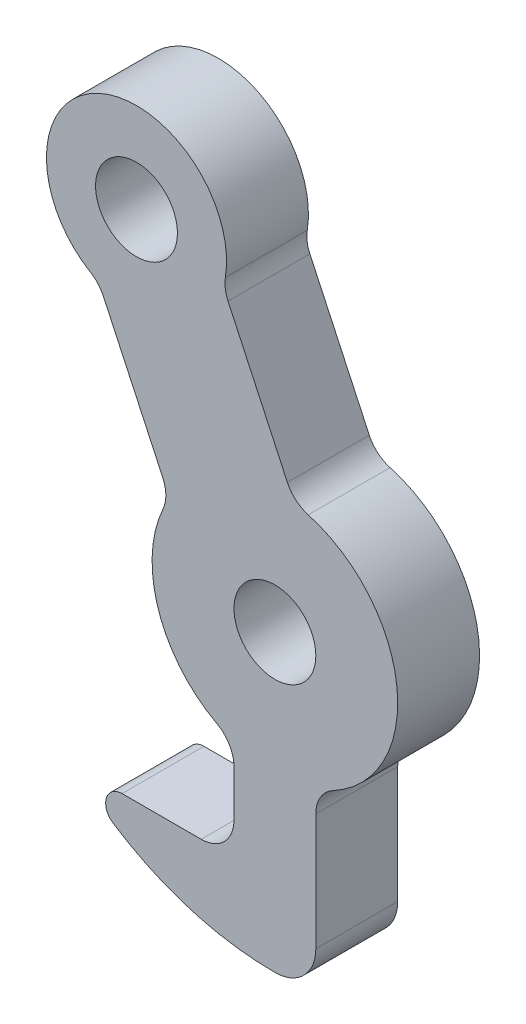
ISO-10303-21;
HEADER;
FILE_DESCRIPTION(('STEP AP214'),'2;1');
FILE_NAME('part.step','',(''),(''),'','','');
FILE_SCHEMA(('AUTOMOTIVE_DESIGN { 1 0 10303 214 1 1 1 1 }'));
ENDSEC;
DATA;
#1=APPLICATION_CONTEXT('core data for automotive mechanical design processes');
#2=APPLICATION_PROTOCOL_DEFINITION('international standard','automotive_design',2000,#1);
#3=PRODUCT_CONTEXT('',#1,'mechanical');
#4=PRODUCT('Part','Part','',(#3));
#5=PRODUCT_RELATED_PRODUCT_CATEGORY('part','',(#4));
#6=PRODUCT_DEFINITION_FORMATION('','',#4);
#7=PRODUCT_DEFINITION_CONTEXT('part definition',#1,'design');
#8=PRODUCT_DEFINITION('design','',#6,#7);
#9=PRODUCT_DEFINITION_SHAPE('','',#8);
#10=(LENGTH_UNIT() NAMED_UNIT(*) SI_UNIT(.MILLI.,.METRE.));
#11=(NAMED_UNIT(*) PLANE_ANGLE_UNIT() SI_UNIT($,.RADIAN.));
#12=(NAMED_UNIT(*) SI_UNIT($,.STERADIAN.) SOLID_ANGLE_UNIT());
#13=UNCERTAINTY_MEASURE_WITH_UNIT(LENGTH_MEASURE(1.E-05),#10,'distance_accuracy_value','');
#14=(GEOMETRIC_REPRESENTATION_CONTEXT(3) GLOBAL_UNCERTAINTY_ASSIGNED_CONTEXT((#13)) GLOBAL_UNIT_ASSIGNED_CONTEXT((#10,
#11,#12)) REPRESENTATION_CONTEXT('',''));
#15=CARTESIAN_POINT('',(0.,0.,0.));
#16=DIRECTION('',(0.,0.,1.));
#17=DIRECTION('',(1.,0.,0.));
#18=AXIS2_PLACEMENT_3D('',#15,#16,#17);
#19=CARTESIAN_POINT('',(0.,0.,3.175));
#20=DIRECTION('',(0.,0.,-1.));
#21=DIRECTION('',(-1.,0.,0.));
#22=AXIS2_PLACEMENT_3D('',#19,#20,#21);
#23=PLANE('',#22);
#24=DIRECTION('',(-1.,0.,0.));
#25=VECTOR('',#24,1.);
#26=CARTESIAN_POINT('',(-3.175,-16.7736111017527,3.175));
#27=LINE('',#26,#25);
#28=CARTESIAN_POINT('',(-5.715,-16.7736111017527,3.175));
#29=VERTEX_POINT('',#28);
#30=CARTESIAN_POINT('',(-11.8556399409187,-16.7736111017527,3.175));
#31=VERTEX_POINT('',#30);
#32=EDGE_CURVE('E192',#29,#31,#27,.T.);
#33=ORIENTED_EDGE('',*,*,#32,.T.);
#34=CARTESIAN_POINT('',(-11.8556399409187,-18.0436111017527,3.175));
#35=DIRECTION('',(0.,0.,-1.));
#36=DIRECTION('',(-1.,0.,0.));
#37=AXIS2_PLACEMENT_3D('',#34,#35,#36);
#38=CIRCLE('',#37,1.27);
#39=CARTESIAN_POINT('',(-12.5530305256786,-19.1049999900911,3.175));
#40=VERTEX_POINT('',#39);
#41=EDGE_CURVE('E11',#31,#40,#38,.F.);
#42=ORIENTED_EDGE('',*,*,#41,.T.);
#43=CARTESIAN_POINT('',(0.,0.,3.175));
#44=DIRECTION('',(0.,0.,1.));
#45=DIRECTION('',(-1.,0.,0.));
#46=AXIS2_PLACEMENT_3D('',#43,#44,#45);
#47=CIRCLE('',#46,22.86);
#48=CARTESIAN_POINT('',(0.,-22.86,3.175));
#49=VERTEX_POINT('',#48);
#50=EDGE_CURVE('E163',#40,#49,#47,.T.);
#51=ORIENTED_EDGE('',*,*,#50,.T.);
#52=CARTESIAN_POINT('',(0.,-19.685,3.175));
#53=DIRECTION('',(0.,0.,1.));
#54=DIRECTION('',(1.,0.,0.));
#55=AXIS2_PLACEMENT_3D('',#52,#53,#54);
#56=CIRCLE('',#55,3.175);
#57=CARTESIAN_POINT('',(3.175,-19.685,3.175));
#58=VERTEX_POINT('',#57);
#59=EDGE_CURVE('E167',#49,#58,#56,.T.);
#60=ORIENTED_EDGE('',*,*,#59,.T.);
#61=DIRECTION('',(0.,1.,0.));
#62=VECTOR('',#61,1.);
#63=CARTESIAN_POINT('',(3.175,-8.98025612106915,3.175));
#64=LINE('',#63,#62);
#65=CARTESIAN_POINT('',(3.175,-10.6255823369828,3.175));
#66=VERTEX_POINT('',#65);
#67=EDGE_CURVE('E183',#58,#66,#64,.T.);
#68=ORIENTED_EDGE('',*,*,#67,.T.);
#69=CARTESIAN_POINT('',(5.715,-10.6255823369828,3.175));
#70=DIRECTION('',(0.,0.,-1.));
#71=DIRECTION('',(-1.,0.,0.));
#72=AXIS2_PLACEMENT_3D('',#69,#70,#71);
#73=CIRCLE('',#72,2.54);
#74=CARTESIAN_POINT('',(4.51184210526316,-8.38861763446007,3.175));
#75=VERTEX_POINT('',#74);
#76=EDGE_CURVE('E246',#66,#75,#73,.T.);
#77=ORIENTED_EDGE('',*,*,#76,.T.);
#78=CARTESIAN_POINT('',(0.,0.,3.175));
#79=DIRECTION('',(0.,0.,1.));
#80=DIRECTION('',(1.,0.,0.));
#81=AXIS2_PLACEMENT_3D('',#78,#79,#80);
#82=CIRCLE('',#81,9.525);
#83=CARTESIAN_POINT('',(2.58391931769006,9.16782340360394,3.175));
#84=VERTEX_POINT('',#83);
#85=EDGE_CURVE('E394',#75,#84,#82,.T.);
#86=ORIENTED_EDGE('',*,*,#85,.T.);
#87=CARTESIAN_POINT('',(3.27296446907408,11.6125763112317,3.175));
#88=DIRECTION('',(0.,0.,-1.));
#89=DIRECTION('',(-1.,0.,0.));
#90=AXIS2_PLACEMENT_3D('',#87,#88,#89);
#91=CIRCLE('',#90,2.54);
#92=CARTESIAN_POINT('',(0.970942690000982,10.5391259264103,3.175));
#93=VERTEX_POINT('',#92);
#94=EDGE_CURVE('E242',#84,#93,#91,.T.);
#95=ORIENTED_EDGE('',*,*,#94,.T.);
#96=DIRECTION('',(-0.422618261740694,0.906307787036652,0.));
#97=VECTOR('',#96,1.);
#98=CARTESIAN_POINT('',(1.49919933142622,9.40627590306872,3.175));
#99=LINE('',#98,#97);
#100=CARTESIAN_POINT('',(-3.63517605362071,20.416979448796,3.175));
#101=VERTEX_POINT('',#100);
#102=EDGE_CURVE('E391',#93,#101,#99,.T.);
#103=ORIENTED_EDGE('',*,*,#102,.T.);
#104=CARTESIAN_POINT('',(-1.33315427454761,21.4904298336173,3.175));
#105=DIRECTION('',(0.,0.,-1.));
#106=DIRECTION('',(-1.,0.,0.));
#107=AXIS2_PLACEMENT_3D('',#104,#105,#106);
#108=CIRCLE('',#107,2.54);
#109=CARTESIAN_POINT('',(-3.84018082752522,21.8983732888476,3.175));
#110=VERTEX_POINT('',#109);
#111=EDGE_CURVE('E230',#101,#110,#108,.T.);
#112=ORIENTED_EDGE('',*,*,#111,.T.);
#113=CARTESIAN_POINT('',(-10.7345038482136,23.020217790731,3.175));
#114=DIRECTION('',(0.,0.,1.));
#115=DIRECTION('',(1.,0.,0.));
#116=AXIS2_PLACEMENT_3D('',#113,#114,#115);
#117=CIRCLE('',#116,6.985);
#118=CARTESIAN_POINT('',(-14.3067065163776,17.0177522058598,3.175));
#119=VERTEX_POINT('',#118);
#120=EDGE_CURVE('E388',#110,#119,#117,.T.);
#121=ORIENTED_EDGE('',*,*,#120,.T.);
#122=CARTESIAN_POINT('',(-15.6056893048008,14.8350374477249,3.175));
#123=DIRECTION('',(0.,0.,-1.));
#124=DIRECTION('',(-1.,0.,0.));
#125=AXIS2_PLACEMENT_3D('',#122,#123,#124);
#126=CIRCLE('',#125,2.54);
#127=CARTESIAN_POINT('',(-13.3036675257277,15.9084878325462,3.175));
#128=VERTEX_POINT('',#127);
#129=EDGE_CURVE('E234',#119,#128,#126,.T.);
#130=ORIENTED_EDGE('',*,*,#129,.T.);
#131=DIRECTION('',(0.422618261740694,-0.906307787036652,0.));
#132=VECTOR('',#131,1.);
#133=CARTESIAN_POINT('',(-8.1692921406808,4.89778428681899,3.175));
#134=LINE('',#133,#132);
#135=CARTESIAN_POINT('',(-8.69754878210603,6.03063431016057,3.175));
#136=VERTEX_POINT('',#135);
#137=EDGE_CURVE('E383',#128,#136,#134,.T.);
#138=ORIENTED_EDGE('',*,*,#137,.T.);
#139=CARTESIAN_POINT('',(-10.9995705611791,4.95718392533921,3.175));
#140=DIRECTION('',(0.,0.,-1.));
#141=DIRECTION('',(-1.,0.,0.));
#142=AXIS2_PLACEMENT_3D('',#139,#140,#141);
#143=CIRCLE('',#142,2.54);
#144=CARTESIAN_POINT('',(-8.68387149566773,3.91356625684674,3.175));
#145=VERTEX_POINT('',#144);
#146=EDGE_CURVE('E238',#136,#145,#143,.T.);
#147=ORIENTED_EDGE('',*,*,#146,.T.);
#148=CARTESIAN_POINT('',(0.,0.,3.175));
#149=DIRECTION('',(0.,0.,1.));
#150=DIRECTION('',(1.,0.,0.));
#151=AXIS2_PLACEMENT_3D('',#148,#149,#150);
#152=CIRCLE('',#151,9.525);
#153=CARTESIAN_POINT('',(-4.51184210526316,-8.38861763446007,3.175));
#154=VERTEX_POINT('',#153);
#155=EDGE_CURVE('E380',#145,#154,#152,.T.);
#156=ORIENTED_EDGE('',*,*,#155,.T.);
#157=CARTESIAN_POINT('',(-5.715,-10.6255823369828,3.175));
#158=DIRECTION('',(0.,0.,-1.));
#159=DIRECTION('',(-1.,0.,0.));
#160=AXIS2_PLACEMENT_3D('',#157,#158,#159);
#161=CIRCLE('',#160,2.54);
#162=CARTESIAN_POINT('',(-3.175,-10.6255823369828,3.175));
#163=VERTEX_POINT('',#162);
#164=EDGE_CURVE('E250',#154,#163,#161,.T.);
#165=ORIENTED_EDGE('',*,*,#164,.T.);
#166=DIRECTION('',(0.,-1.,0.));
#167=VECTOR('',#166,1.);
#168=CARTESIAN_POINT('',(-3.175,-8.98025612106915,3.175));
#169=LINE('',#168,#167);
#170=CARTESIAN_POINT('',(-3.175,-14.2336111017527,3.175));
#171=VERTEX_POINT('',#170);
#172=EDGE_CURVE('E377',#163,#171,#169,.T.);
#173=ORIENTED_EDGE('',*,*,#172,.T.);
#174=CARTESIAN_POINT('',(-5.715,-14.2336111017527,3.175));
#175=DIRECTION('',(0.,0.,-1.));
#176=DIRECTION('',(-1.,0.,0.));
#177=AXIS2_PLACEMENT_3D('',#174,#175,#176);
#178=CIRCLE('',#177,2.54);
#179=EDGE_CURVE('E254',#171,#29,#178,.T.);
#180=ORIENTED_EDGE('',*,*,#179,.T.);
#181=EDGE_LOOP('',(#33,#42,#51,#60,#68,#77,#86,#95,#103,#112,#121,#130,#138,#147,#156,#165,#173,#180));
#182=FACE_BOUND('',#181,.T.);
#183=CARTESIAN_POINT('',(-10.7345038482136,23.020217790731,3.175));
#184=DIRECTION('',(0.,0.,1.));
#185=DIRECTION('',(1.,0.,0.));
#186=AXIS2_PLACEMENT_3D('',#183,#184,#185);
#187=CIRCLE('',#186,3.17500000000001);
#188=CARTESIAN_POINT('',(-7.55950384821361,23.020217790731,3.175));
#189=VERTEX_POINT('',#188);
#190=EDGE_CURVE('E263',#189,#189,#187,.T.);
#191=ORIENTED_EDGE('',*,*,#190,.F.);
#192=EDGE_LOOP('',(#191));
#193=FACE_BOUND('',#192,.T.);
#194=CARTESIAN_POINT('',(0.,0.,3.175));
#195=DIRECTION('',(0.,0.,1.));
#196=DIRECTION('',(1.,0.,0.));
#197=AXIS2_PLACEMENT_3D('',#194,#195,#196);
#198=CIRCLE('',#197,3.175);
#199=CARTESIAN_POINT('',(3.175,0.,3.175));
#200=VERTEX_POINT('',#199);
#201=EDGE_CURVE('E399',#200,#200,#198,.T.);
#202=ORIENTED_EDGE('',*,*,#201,.F.);
#203=EDGE_LOOP('',(#202));
#204=FACE_BOUND('',#203,.T.);
#205=ADVANCED_FACE('F39',(#182,#193,#204),#23,.F.);
#206=CARTESIAN_POINT('',(0.,0.,-3.175));
#207=DIRECTION('',(0.,0.,-1.));
#208=DIRECTION('',(-1.,0.,0.));
#209=AXIS2_PLACEMENT_3D('',#206,#207,#208);
#210=PLANE('',#209);
#211=CARTESIAN_POINT('',(-10.7345038482136,23.020217790731,-3.175));
#212=DIRECTION('',(0.,0.,1.));
#213=DIRECTION('',(1.,0.,0.));
#214=AXIS2_PLACEMENT_3D('',#211,#212,#213);
#215=CIRCLE('',#214,3.17500000000001);
#216=CARTESIAN_POINT('',(-7.55950384821361,23.020217790731,-3.175));
#217=VERTEX_POINT('',#216);
#218=EDGE_CURVE('E268',#217,#217,#215,.T.);
#219=ORIENTED_EDGE('',*,*,#218,.T.);
#220=EDGE_LOOP('',(#219));
#221=FACE_BOUND('',#220,.T.);
#222=CARTESIAN_POINT('',(0.,0.,-3.175));
#223=DIRECTION('',(0.,0.,1.));
#224=DIRECTION('',(-1.,0.,0.));
#225=AXIS2_PLACEMENT_3D('',#222,#223,#224);
#226=CIRCLE('',#225,22.86);
#227=CARTESIAN_POINT('',(-12.5530305256786,-19.1049999900911,-3.175));
#228=VERTEX_POINT('',#227);
#229=CARTESIAN_POINT('',(0.,-22.86,-3.175));
#230=VERTEX_POINT('',#229);
#231=EDGE_CURVE('E186',#228,#230,#226,.T.);
#232=ORIENTED_EDGE('',*,*,#231,.F.);
#233=CARTESIAN_POINT('',(-11.8556399409187,-18.0436111017527,-3.175));
#234=DIRECTION('',(0.,0.,-1.));
#235=DIRECTION('',(-1.,0.,0.));
#236=AXIS2_PLACEMENT_3D('',#233,#234,#235);
#237=CIRCLE('',#236,1.27);
#238=CARTESIAN_POINT('',(-11.8556399409187,-16.7736111017527,-3.175));
#239=VERTEX_POINT('',#238);
#240=EDGE_CURVE('E61',#228,#239,#237,.T.);
#241=ORIENTED_EDGE('',*,*,#240,.T.);
#242=DIRECTION('',(-1.,0.,0.));
#243=VECTOR('',#242,1.);
#244=CARTESIAN_POINT('',(-3.175,-16.7736111017527,-3.175));
#245=LINE('',#244,#243);
#246=CARTESIAN_POINT('',(-5.715,-16.7736111017527,-3.175));
#247=VERTEX_POINT('',#246);
#248=EDGE_CURVE('E174',#247,#239,#245,.T.);
#249=ORIENTED_EDGE('',*,*,#248,.F.);
#250=CARTESIAN_POINT('',(-5.715,-14.2336111017527,-3.175));
#251=DIRECTION('',(0.,0.,-1.));
#252=DIRECTION('',(-1.,0.,0.));
#253=AXIS2_PLACEMENT_3D('',#250,#251,#252);
#254=CIRCLE('',#253,2.54);
#255=CARTESIAN_POINT('',(-3.175,-14.2336111017527,-3.175));
#256=VERTEX_POINT('',#255);
#257=EDGE_CURVE('E252',#247,#256,#254,.F.);
#258=ORIENTED_EDGE('',*,*,#257,.T.);
#259=DIRECTION('',(0.,-1.,0.));
#260=VECTOR('',#259,1.);
#261=CARTESIAN_POINT('',(-3.175,-8.98025612106915,-3.175));
#262=LINE('',#261,#260);
#263=CARTESIAN_POINT('',(-3.175,-10.6255823369828,-3.175));
#264=VERTEX_POINT('',#263);
#265=EDGE_CURVE('E290',#264,#256,#262,.T.);
#266=ORIENTED_EDGE('',*,*,#265,.F.);
#267=CARTESIAN_POINT('',(-5.715,-10.6255823369828,-3.175));
#268=DIRECTION('',(0.,0.,-1.));
#269=DIRECTION('',(-1.,0.,0.));
#270=AXIS2_PLACEMENT_3D('',#267,#268,#269);
#271=CIRCLE('',#270,2.54);
#272=CARTESIAN_POINT('',(-4.51184210526316,-8.38861763446007,-3.175));
#273=VERTEX_POINT('',#272);
#274=EDGE_CURVE('E248',#264,#273,#271,.F.);
#275=ORIENTED_EDGE('',*,*,#274,.T.);
#276=CARTESIAN_POINT('',(0.,0.,-3.175));
#277=DIRECTION('',(0.,0.,1.));
#278=DIRECTION('',(1.,0.,0.));
#279=AXIS2_PLACEMENT_3D('',#276,#277,#278);
#280=CIRCLE('',#279,9.525);
#281=CARTESIAN_POINT('',(-8.68387149566773,3.91356625684674,-3.175));
#282=VERTEX_POINT('',#281);
#283=EDGE_CURVE('E287',#282,#273,#280,.T.);
#284=ORIENTED_EDGE('',*,*,#283,.F.);
#285=CARTESIAN_POINT('',(-10.9995705611791,4.95718392533921,-3.175));
#286=DIRECTION('',(0.,0.,-1.));
#287=DIRECTION('',(-1.,0.,0.));
#288=AXIS2_PLACEMENT_3D('',#285,#286,#287);
#289=CIRCLE('',#288,2.54);
#290=CARTESIAN_POINT('',(-8.69754878210603,6.03063431016057,-3.175));
#291=VERTEX_POINT('',#290);
#292=EDGE_CURVE('E236',#282,#291,#289,.F.);
#293=ORIENTED_EDGE('',*,*,#292,.T.);
#294=DIRECTION('',(0.422618261740694,-0.906307787036652,0.));
#295=VECTOR('',#294,1.);
#296=CARTESIAN_POINT('',(-8.1692921406808,4.89778428681899,-3.175));
#297=LINE('',#296,#295);
#298=CARTESIAN_POINT('',(-13.3036675257277,15.9084878325462,-3.175));
#299=VERTEX_POINT('',#298);
#300=EDGE_CURVE('E284',#299,#291,#297,.T.);
#301=ORIENTED_EDGE('',*,*,#300,.F.);
#302=CARTESIAN_POINT('',(-15.6056893048008,14.8350374477249,-3.175));
#303=DIRECTION('',(0.,0.,-1.));
#304=DIRECTION('',(-1.,0.,0.));
#305=AXIS2_PLACEMENT_3D('',#302,#303,#304);
#306=CIRCLE('',#305,2.54);
#307=CARTESIAN_POINT('',(-14.3067065163776,17.0177522058598,-3.175));
#308=VERTEX_POINT('',#307);
#309=EDGE_CURVE('E232',#299,#308,#306,.F.);
#310=ORIENTED_EDGE('',*,*,#309,.T.);
#311=CARTESIAN_POINT('',(-10.7345038482136,23.020217790731,-3.175));
#312=DIRECTION('',(0.,0.,1.));
#313=DIRECTION('',(1.,0.,0.));
#314=AXIS2_PLACEMENT_3D('',#311,#312,#313);
#315=CIRCLE('',#314,6.985);
#316=CARTESIAN_POINT('',(-3.84018082752522,21.8983732888476,-3.175));
#317=VERTEX_POINT('',#316);
#318=EDGE_CURVE('E281',#317,#308,#315,.T.);
#319=ORIENTED_EDGE('',*,*,#318,.F.);
#320=CARTESIAN_POINT('',(-1.33315427454761,21.4904298336173,-3.175));
#321=DIRECTION('',(0.,0.,-1.));
#322=DIRECTION('',(-1.,0.,0.));
#323=AXIS2_PLACEMENT_3D('',#320,#321,#322);
#324=CIRCLE('',#323,2.54);
#325=CARTESIAN_POINT('',(-3.63517605362071,20.416979448796,-3.175));
#326=VERTEX_POINT('',#325);
#327=EDGE_CURVE('E228',#317,#326,#324,.F.);
#328=ORIENTED_EDGE('',*,*,#327,.T.);
#329=DIRECTION('',(-0.422618261740694,0.906307787036652,0.));
#330=VECTOR('',#329,1.);
#331=CARTESIAN_POINT('',(1.49919933142622,9.40627590306872,-3.175));
#332=LINE('',#331,#330);
#333=CARTESIAN_POINT('',(0.970942690000982,10.5391259264103,-3.175));
#334=VERTEX_POINT('',#333);
#335=EDGE_CURVE('E278',#334,#326,#332,.T.);
#336=ORIENTED_EDGE('',*,*,#335,.F.);
#337=CARTESIAN_POINT('',(3.27296446907408,11.6125763112317,-3.175));
#338=DIRECTION('',(0.,0.,-1.));
#339=DIRECTION('',(-1.,0.,0.));
#340=AXIS2_PLACEMENT_3D('',#337,#338,#339);
#341=CIRCLE('',#340,2.54);
#342=CARTESIAN_POINT('',(2.58391931769006,9.16782340360394,-3.175));
#343=VERTEX_POINT('',#342);
#344=EDGE_CURVE('E240',#334,#343,#341,.F.);
#345=ORIENTED_EDGE('',*,*,#344,.T.);
#346=CARTESIAN_POINT('',(0.,0.,-3.175));
#347=DIRECTION('',(0.,0.,1.));
#348=DIRECTION('',(1.,0.,0.));
#349=AXIS2_PLACEMENT_3D('',#346,#347,#348);
#350=CIRCLE('',#349,9.525);
#351=CARTESIAN_POINT('',(4.51184210526316,-8.38861763446007,-3.175));
#352=VERTEX_POINT('',#351);
#353=EDGE_CURVE('E275',#352,#343,#350,.T.);
#354=ORIENTED_EDGE('',*,*,#353,.F.);
#355=CARTESIAN_POINT('',(5.715,-10.6255823369828,-3.175));
#356=DIRECTION('',(0.,0.,-1.));
#357=DIRECTION('',(-1.,0.,0.));
#358=AXIS2_PLACEMENT_3D('',#355,#356,#357);
#359=CIRCLE('',#358,2.54);
#360=CARTESIAN_POINT('',(3.175,-10.6255823369828,-3.175));
#361=VERTEX_POINT('',#360);
#362=EDGE_CURVE('E244',#352,#361,#359,.F.);
#363=ORIENTED_EDGE('',*,*,#362,.T.);
#364=DIRECTION('',(0.,1.,0.));
#365=VECTOR('',#364,1.);
#366=CARTESIAN_POINT('',(3.175,-8.98025612106915,-3.175));
#367=LINE('',#366,#365);
#368=CARTESIAN_POINT('',(3.175,-19.685,-3.175));
#369=VERTEX_POINT('',#368);
#370=EDGE_CURVE('E265',#369,#361,#367,.T.);
#371=ORIENTED_EDGE('',*,*,#370,.F.);
#372=CARTESIAN_POINT('',(0.,-19.685,-3.175));
#373=DIRECTION('',(0.,0.,1.));
#374=DIRECTION('',(1.,0.,0.));
#375=AXIS2_PLACEMENT_3D('',#372,#373,#374);
#376=CIRCLE('',#375,3.175);
#377=EDGE_CURVE('E262',#230,#369,#376,.T.);
#378=ORIENTED_EDGE('',*,*,#377,.F.);
#379=EDGE_LOOP('',(#232,#241,#249,#258,#266,#275,#284,#293,#301,#310,#319,#328,#336,#345,#354,
#363,#371,#378));
#380=FACE_BOUND('',#379,.T.);
#381=CARTESIAN_POINT('',(0.,0.,-3.175));
#382=DIRECTION('',(0.,0.,1.));
#383=DIRECTION('',(1.,0.,0.));
#384=AXIS2_PLACEMENT_3D('',#381,#382,#383);
#385=CIRCLE('',#384,3.175);
#386=CARTESIAN_POINT('',(3.175,0.,-3.175));
#387=VERTEX_POINT('',#386);
#388=EDGE_CURVE('E401',#387,#387,#385,.T.);
#389=ORIENTED_EDGE('',*,*,#388,.T.);
#390=EDGE_LOOP('',(#389));
#391=FACE_BOUND('',#390,.T.);
#392=ADVANCED_FACE('F259',(#221,#380,#391),#210,.T.);
#393=CARTESIAN_POINT('',(0.,0.,3.175));
#394=DIRECTION('',(0.,0.,-1.));
#395=DIRECTION('',(-1.,0.,0.));
#396=AXIS2_PLACEMENT_3D('',#393,#394,#395);
#397=CYLINDRICAL_SURFACE('',#396,22.86);
#398=ORIENTED_EDGE('',*,*,#50,.F.);
#399=DIRECTION('',(0.,0.,-1.));
#400=VECTOR('',#399,1.);
#401=CARTESIAN_POINT('',(-12.5530305256786,-19.1049999900911,3.175));
#402=LINE('',#401,#400);
#403=EDGE_CURVE('E256',#40,#228,#402,.T.);
#404=ORIENTED_EDGE('',*,*,#403,.T.);
#405=ORIENTED_EDGE('',*,*,#231,.T.);
#406=DIRECTION('',(0.,0.,-1.));
#407=VECTOR('',#406,1.);
#408=CARTESIAN_POINT('',(0.,-22.86,3.175));
#409=LINE('',#408,#407);
#410=EDGE_CURVE('E179',#49,#230,#409,.T.);
#411=ORIENTED_EDGE('',*,*,#410,.F.);
#412=EDGE_LOOP('',(#398,#404,#405,#411));
#413=FACE_BOUND('',#412,.T.);
#414=ADVANCED_FACE('F185',(#413),#397,.T.);
#415=CARTESIAN_POINT('',(0.,-19.685,3.175));
#416=DIRECTION('',(0.,0.,-1.));
#417=DIRECTION('',(-1.,0.,0.));
#418=AXIS2_PLACEMENT_3D('',#415,#416,#417);
#419=CYLINDRICAL_SURFACE('',#418,3.175);
#420=ORIENTED_EDGE('',*,*,#377,.T.);
#421=DIRECTION('',(0.,0.,-1.));
#422=VECTOR('',#421,1.);
#423=CARTESIAN_POINT('',(3.175,-19.685,3.175));
#424=LINE('',#423,#422);
#425=EDGE_CURVE('E181',#58,#369,#424,.T.);
#426=ORIENTED_EDGE('',*,*,#425,.F.);
#427=ORIENTED_EDGE('',*,*,#59,.F.);
#428=ORIENTED_EDGE('',*,*,#410,.T.);
#429=EDGE_LOOP('',(#420,#426,#427,#428));
#430=FACE_BOUND('',#429,.T.);
#431=ADVANCED_FACE('F178',(#430),#419,.T.);
#432=CARTESIAN_POINT('',(3.175,-8.98025612106915,3.175));
#433=DIRECTION('',(-1.,0.,0.));
#434=DIRECTION('',(0.,-1.,0.));
#435=AXIS2_PLACEMENT_3D('',#432,#433,#434);
#436=PLANE('',#435);
#437=ORIENTED_EDGE('',*,*,#370,.T.);
#438=DIRECTION('',(0.,0.,1.));
#439=VECTOR('',#438,1.);
#440=CARTESIAN_POINT('',(3.175,-10.6255823369828,3.175));
#441=LINE('',#440,#439);
#442=EDGE_CURVE('E218',#361,#66,#441,.T.);
#443=ORIENTED_EDGE('',*,*,#442,.T.);
#444=ORIENTED_EDGE('',*,*,#67,.F.);
#445=ORIENTED_EDGE('',*,*,#425,.T.);
#446=EDGE_LOOP('',(#437,#443,#444,#445));
#447=FACE_BOUND('',#446,.T.);
#448=ADVANCED_FACE('F337',(#447),#436,.F.);
#449=CARTESIAN_POINT('',(0.,0.,3.175));
#450=DIRECTION('',(0.,0.,-1.));
#451=DIRECTION('',(-1.,0.,0.));
#452=AXIS2_PLACEMENT_3D('',#449,#450,#451);
#453=CYLINDRICAL_SURFACE('',#452,9.525);
#454=ORIENTED_EDGE('',*,*,#353,.T.);
#455=DIRECTION('',(0.,0.,-1.));
#456=VECTOR('',#455,1.);
#457=CARTESIAN_POINT('',(2.58391931769006,9.16782340360394,3.175));
#458=LINE('',#457,#456);
#459=EDGE_CURVE('E216',#343,#84,#458,.F.);
#460=ORIENTED_EDGE('',*,*,#459,.T.);
#461=ORIENTED_EDGE('',*,*,#85,.F.);
#462=DIRECTION('',(0.,0.,-1.));
#463=VECTOR('',#462,1.);
#464=CARTESIAN_POINT('',(4.51184210526316,-8.38861763446007,3.175));
#465=LINE('',#464,#463);
#466=EDGE_CURVE('E213',#75,#352,#465,.T.);
#467=ORIENTED_EDGE('',*,*,#466,.T.);
#468=EDGE_LOOP('',(#454,#460,#461,#467));
#469=FACE_BOUND('',#468,.T.);
#470=ADVANCED_FACE('F333',(#469),#453,.T.);
#471=CARTESIAN_POINT('',(1.49919933142622,9.40627590306872,3.175));
#472=DIRECTION('',(-0.906307787036652,-0.422618261740694,0.));
#473=DIRECTION('',(0.422618261740694,-0.906307787036653,0.));
#474=AXIS2_PLACEMENT_3D('',#471,#472,#473);
#475=PLANE('',#474);
#476=ORIENTED_EDGE('',*,*,#335,.T.);
#477=DIRECTION('',(0.,0.,1.));
#478=VECTOR('',#477,1.);
#479=CARTESIAN_POINT('',(-3.63517605362071,20.416979448796,3.175));
#480=LINE('',#479,#478);
#481=EDGE_CURVE('E201',#326,#101,#480,.T.);
#482=ORIENTED_EDGE('',*,*,#481,.T.);
#483=ORIENTED_EDGE('',*,*,#102,.F.);
#484=DIRECTION('',(0.,0.,1.));
#485=VECTOR('',#484,1.);
#486=CARTESIAN_POINT('',(0.970942690000983,10.5391259264103,-3.175));
#487=LINE('',#486,#485);
#488=EDGE_CURVE('E198',#93,#334,#487,.F.);
#489=ORIENTED_EDGE('',*,*,#488,.T.);
#490=EDGE_LOOP('',(#476,#482,#483,#489));
#491=FACE_BOUND('',#490,.T.);
#492=ADVANCED_FACE('F329',(#491),#475,.F.);
#493=CARTESIAN_POINT('',(-10.7345038482136,23.020217790731,3.175));
#494=DIRECTION('',(0.,0.,-1.));
#495=DIRECTION('',(-1.,0.,0.));
#496=AXIS2_PLACEMENT_3D('',#493,#494,#495);
#497=CYLINDRICAL_SURFACE('',#496,6.985);
#498=ORIENTED_EDGE('',*,*,#120,.F.);
#499=DIRECTION('',(0.,0.,-1.));
#500=VECTOR('',#499,1.);
#501=CARTESIAN_POINT('',(-3.84018082752522,21.8983732888476,3.175));
#502=LINE('',#501,#500);
#503=EDGE_CURVE('E190',#110,#317,#502,.T.);
#504=ORIENTED_EDGE('',*,*,#503,.T.);
#505=ORIENTED_EDGE('',*,*,#318,.T.);
#506=DIRECTION('',(0.,0.,-1.));
#507=VECTOR('',#506,1.);
#508=CARTESIAN_POINT('',(-14.3067065163776,17.0177522058598,3.175));
#509=LINE('',#508,#507);
#510=EDGE_CURVE('E188',#308,#119,#509,.F.);
#511=ORIENTED_EDGE('',*,*,#510,.T.);
#512=EDGE_LOOP('',(#498,#504,#505,#511));
#513=FACE_BOUND('',#512,.T.);
#514=ADVANCED_FACE('F325',(#513),#497,.T.);
#515=CARTESIAN_POINT('',(-8.1692921406808,4.89778428681899,3.175));
#516=DIRECTION('',(0.906307787036652,0.422618261740694,0.));
#517=DIRECTION('',(-0.422618261740694,0.906307787036653,0.));
#518=AXIS2_PLACEMENT_3D('',#515,#516,#517);
#519=PLANE('',#518);
#520=ORIENTED_EDGE('',*,*,#137,.F.);
#521=DIRECTION('',(0.,0.,1.));
#522=VECTOR('',#521,1.);
#523=CARTESIAN_POINT('',(-13.3036675257277,15.9084878325462,-3.175));
#524=LINE('',#523,#522);
#525=EDGE_CURVE('E205',#128,#299,#524,.F.);
#526=ORIENTED_EDGE('',*,*,#525,.T.);
#527=ORIENTED_EDGE('',*,*,#300,.T.);
#528=DIRECTION('',(0.,0.,1.));
#529=VECTOR('',#528,1.);
#530=CARTESIAN_POINT('',(-8.69754878210603,6.03063431016057,3.175));
#531=LINE('',#530,#529);
#532=EDGE_CURVE('E203',#291,#136,#531,.T.);
#533=ORIENTED_EDGE('',*,*,#532,.T.);
#534=EDGE_LOOP('',(#520,#526,#527,#533));
#535=FACE_BOUND('',#534,.T.);
#536=ADVANCED_FACE('F321',(#535),#519,.F.);
#537=CARTESIAN_POINT('',(0.,0.,3.175));
#538=DIRECTION('',(0.,0.,-1.));
#539=DIRECTION('',(-1.,0.,0.));
#540=AXIS2_PLACEMENT_3D('',#537,#538,#539);
#541=CYLINDRICAL_SURFACE('',#540,9.525);
#542=ORIENTED_EDGE('',*,*,#155,.F.);
#543=DIRECTION('',(0.,0.,-1.));
#544=VECTOR('',#543,1.);
#545=CARTESIAN_POINT('',(-8.68387149566773,3.91356625684674,3.175));
#546=LINE('',#545,#544);
#547=EDGE_CURVE('E210',#145,#282,#546,.T.);
#548=ORIENTED_EDGE('',*,*,#547,.T.);
#549=ORIENTED_EDGE('',*,*,#283,.T.);
#550=DIRECTION('',(0.,0.,-1.));
#551=VECTOR('',#550,1.);
#552=CARTESIAN_POINT('',(-4.51184210526316,-8.38861763446007,3.175));
#553=LINE('',#552,#551);
#554=EDGE_CURVE('E208',#273,#154,#553,.F.);
#555=ORIENTED_EDGE('',*,*,#554,.T.);
#556=EDGE_LOOP('',(#542,#548,#549,#555));
#557=FACE_BOUND('',#556,.T.);
#558=ADVANCED_FACE('F317',(#557),#541,.T.);
#559=CARTESIAN_POINT('',(-3.175,-8.98025612106915,3.175));
#560=DIRECTION('',(1.,0.,0.));
#561=DIRECTION('',(0.,1.,0.));
#562=AXIS2_PLACEMENT_3D('',#559,#560,#561);
#563=PLANE('',#562);
#564=ORIENTED_EDGE('',*,*,#172,.F.);
#565=DIRECTION('',(0.,0.,1.));
#566=VECTOR('',#565,1.);
#567=CARTESIAN_POINT('',(-3.175,-10.6255823369828,-3.175));
#568=LINE('',#567,#566);
#569=EDGE_CURVE('E222',#163,#264,#568,.F.);
#570=ORIENTED_EDGE('',*,*,#569,.T.);
#571=ORIENTED_EDGE('',*,*,#265,.T.);
#572=DIRECTION('',(0.,0.,-1.));
#573=VECTOR('',#572,1.);
#574=CARTESIAN_POINT('',(-3.175,-14.2336111017527,3.175));
#575=LINE('',#574,#573);
#576=EDGE_CURVE('E220',#256,#171,#575,.F.);
#577=ORIENTED_EDGE('',*,*,#576,.T.);
#578=EDGE_LOOP('',(#564,#570,#571,#577));
#579=FACE_BOUND('',#578,.T.);
#580=ADVANCED_FACE('F314',(#579),#563,.F.);
#581=CARTESIAN_POINT('',(-3.175,-16.7736111017527,3.175));
#582=DIRECTION('',(0.,-1.,0.));
#583=DIRECTION('',(1.,0.,0.));
#584=AXIS2_PLACEMENT_3D('',#581,#582,#583);
#585=PLANE('',#584);
#586=ORIENTED_EDGE('',*,*,#248,.T.);
#587=DIRECTION('',(0.,0.,-1.));
#588=VECTOR('',#587,1.);
#589=CARTESIAN_POINT('',(-11.8556399409187,-16.7736111017527,3.175));
#590=LINE('',#589,#588);
#591=EDGE_CURVE('E47',#239,#31,#590,.F.);
#592=ORIENTED_EDGE('',*,*,#591,.T.);
#593=ORIENTED_EDGE('',*,*,#32,.F.);
#594=DIRECTION('',(0.,0.,-1.));
#595=VECTOR('',#594,1.);
#596=CARTESIAN_POINT('',(-5.715,-16.7736111017527,-3.175));
#597=LINE('',#596,#595);
#598=EDGE_CURVE('E225',#29,#247,#597,.T.);
#599=ORIENTED_EDGE('',*,*,#598,.T.);
#600=EDGE_LOOP('',(#586,#592,#593,#599));
#601=FACE_BOUND('',#600,.T.);
#602=ADVANCED_FACE('F292',(#601),#585,.F.);
#603=CARTESIAN_POINT('',(-10.7345038482136,23.020217790731,3.175));
#604=DIRECTION('',(0.,0.,-1.));
#605=DIRECTION('',(-1.,0.,0.));
#606=AXIS2_PLACEMENT_3D('',#603,#604,#605);
#607=CYLINDRICAL_SURFACE('',#606,3.17500000000001);
#608=ORIENTED_EDGE('',*,*,#190,.T.);
#609=EDGE_LOOP('',(#608));
#610=FACE_BOUND('',#609,.T.);
#611=ORIENTED_EDGE('',*,*,#218,.F.);
#612=EDGE_LOOP('',(#611));
#613=FACE_BOUND('',#612,.T.);
#614=ADVANCED_FACE('F310',(#610,#613),#607,.F.);
#615=CARTESIAN_POINT('',(0.,0.,3.175));
#616=DIRECTION('',(0.,0.,-1.));
#617=DIRECTION('',(-1.,0.,0.));
#618=AXIS2_PLACEMENT_3D('',#615,#616,#617);
#619=CYLINDRICAL_SURFACE('',#618,3.175);
#620=ORIENTED_EDGE('',*,*,#201,.T.);
#621=EDGE_LOOP('',(#620));
#622=FACE_BOUND('',#621,.T.);
#623=ORIENTED_EDGE('',*,*,#388,.F.);
#624=EDGE_LOOP('',(#623));
#625=FACE_BOUND('',#624,.T.);
#626=ADVANCED_FACE('F350',(#622,#625),#619,.F.);
#627=CARTESIAN_POINT('',(-1.33315427454761,21.4904298336173,3.175));
#628=DIRECTION('',(0.,0.,-1.));
#629=DIRECTION('',(-1.,0.,0.));
#630=AXIS2_PLACEMENT_3D('',#627,#628,#629);
#631=CYLINDRICAL_SURFACE('',#630,2.54);
#632=ORIENTED_EDGE('',*,*,#111,.F.);
#633=ORIENTED_EDGE('',*,*,#481,.F.);
#634=ORIENTED_EDGE('',*,*,#327,.F.);
#635=ORIENTED_EDGE('',*,*,#503,.F.);
#636=EDGE_LOOP('',(#632,#633,#634,#635));
#637=FACE_BOUND('',#636,.T.);
#638=ADVANCED_FACE('F346',(#637),#631,.F.);
#639=CARTESIAN_POINT('',(-15.6056893048008,14.8350374477249,3.175));
#640=DIRECTION('',(0.,0.,-1.));
#641=DIRECTION('',(-1.,0.,0.));
#642=AXIS2_PLACEMENT_3D('',#639,#640,#641);
#643=CYLINDRICAL_SURFACE('',#642,2.54);
#644=ORIENTED_EDGE('',*,*,#129,.F.);
#645=ORIENTED_EDGE('',*,*,#510,.F.);
#646=ORIENTED_EDGE('',*,*,#309,.F.);
#647=ORIENTED_EDGE('',*,*,#525,.F.);
#648=EDGE_LOOP('',(#644,#645,#646,#647));
#649=FACE_BOUND('',#648,.T.);
#650=ADVANCED_FACE('F349',(#649),#643,.F.);
#651=CARTESIAN_POINT('',(-10.9995705611791,4.95718392533921,3.175));
#652=DIRECTION('',(0.,0.,-1.));
#653=DIRECTION('',(-1.,0.,0.));
#654=AXIS2_PLACEMENT_3D('',#651,#652,#653);
#655=CYLINDRICAL_SURFACE('',#654,2.54);
#656=ORIENTED_EDGE('',*,*,#146,.F.);
#657=ORIENTED_EDGE('',*,*,#532,.F.);
#658=ORIENTED_EDGE('',*,*,#292,.F.);
#659=ORIENTED_EDGE('',*,*,#547,.F.);
#660=EDGE_LOOP('',(#656,#657,#658,#659));
#661=FACE_BOUND('',#660,.T.);
#662=ADVANCED_FACE('F354',(#661),#655,.F.);
#663=CARTESIAN_POINT('',(3.27296446907408,11.6125763112317,3.175));
#664=DIRECTION('',(0.,0.,-1.));
#665=DIRECTION('',(-1.,0.,0.));
#666=AXIS2_PLACEMENT_3D('',#663,#664,#665);
#667=CYLINDRICAL_SURFACE('',#666,2.54);
#668=ORIENTED_EDGE('',*,*,#94,.F.);
#669=ORIENTED_EDGE('',*,*,#459,.F.);
#670=ORIENTED_EDGE('',*,*,#344,.F.);
#671=ORIENTED_EDGE('',*,*,#488,.F.);
#672=EDGE_LOOP('',(#668,#669,#670,#671));
#673=FACE_BOUND('',#672,.T.);
#674=ADVANCED_FACE('F358',(#673),#667,.F.);
#675=CARTESIAN_POINT('',(5.715,-10.6255823369828,3.175));
#676=DIRECTION('',(0.,0.,-1.));
#677=DIRECTION('',(-1.,0.,0.));
#678=AXIS2_PLACEMENT_3D('',#675,#676,#677);
#679=CYLINDRICAL_SURFACE('',#678,2.54);
#680=ORIENTED_EDGE('',*,*,#76,.F.);
#681=ORIENTED_EDGE('',*,*,#442,.F.);
#682=ORIENTED_EDGE('',*,*,#362,.F.);
#683=ORIENTED_EDGE('',*,*,#466,.F.);
#684=EDGE_LOOP('',(#680,#681,#682,#683));
#685=FACE_BOUND('',#684,.T.);
#686=ADVANCED_FACE('F362',(#685),#679,.F.);
#687=CARTESIAN_POINT('',(-5.715,-10.6255823369828,3.175));
#688=DIRECTION('',(0.,0.,-1.));
#689=DIRECTION('',(-1.,0.,0.));
#690=AXIS2_PLACEMENT_3D('',#687,#688,#689);
#691=CYLINDRICAL_SURFACE('',#690,2.54);
#692=ORIENTED_EDGE('',*,*,#164,.F.);
#693=ORIENTED_EDGE('',*,*,#554,.F.);
#694=ORIENTED_EDGE('',*,*,#274,.F.);
#695=ORIENTED_EDGE('',*,*,#569,.F.);
#696=EDGE_LOOP('',(#692,#693,#694,#695));
#697=FACE_BOUND('',#696,.T.);
#698=ADVANCED_FACE('F300',(#697),#691,.F.);
#699=CARTESIAN_POINT('',(-5.715,-14.2336111017527,3.175));
#700=DIRECTION('',(0.,0.,1.));
#701=DIRECTION('',(1.,0.,0.));
#702=AXIS2_PLACEMENT_3D('',#699,#700,#701);
#703=CYLINDRICAL_SURFACE('',#702,2.54);
#704=ORIENTED_EDGE('',*,*,#179,.F.);
#705=ORIENTED_EDGE('',*,*,#576,.F.);
#706=ORIENTED_EDGE('',*,*,#257,.F.);
#707=ORIENTED_EDGE('',*,*,#598,.F.);
#708=EDGE_LOOP('',(#704,#705,#706,#707));
#709=FACE_BOUND('',#708,.T.);
#710=ADVANCED_FACE('F295',(#709),#703,.F.);
#711=CARTESIAN_POINT('',(-11.8556399409187,-18.0436111017527,3.175));
#712=DIRECTION('',(0.,0.,-1.));
#713=DIRECTION('',(-1.,0.,0.));
#714=AXIS2_PLACEMENT_3D('',#711,#712,#713);
#715=CYLINDRICAL_SURFACE('',#714,1.27);
#716=ORIENTED_EDGE('',*,*,#41,.F.);
#717=ORIENTED_EDGE('',*,*,#591,.F.);
#718=ORIENTED_EDGE('',*,*,#240,.F.);
#719=ORIENTED_EDGE('',*,*,#403,.F.);
#720=EDGE_LOOP('',(#716,#717,#718,#719));
#721=FACE_BOUND('',#720,.T.);
#722=ADVANCED_FACE('F41',(#721),#715,.T.);
#723=CLOSED_SHELL('',(#205,#392,#414,#431,#448,#470,#492,#514,#536,#558,#580,#602,#614,#626,
#638,#650,#662,#674,#686,#698,#710,#722));
#724=MANIFOLD_SOLID_BREP('B2',#723);
#725=ADVANCED_BREP_SHAPE_REPRESENTATION('',(#18,#724),#14);
#726=SHAPE_DEFINITION_REPRESENTATION(#9,#725);
ENDSEC;
END-ISO-10303-21;
